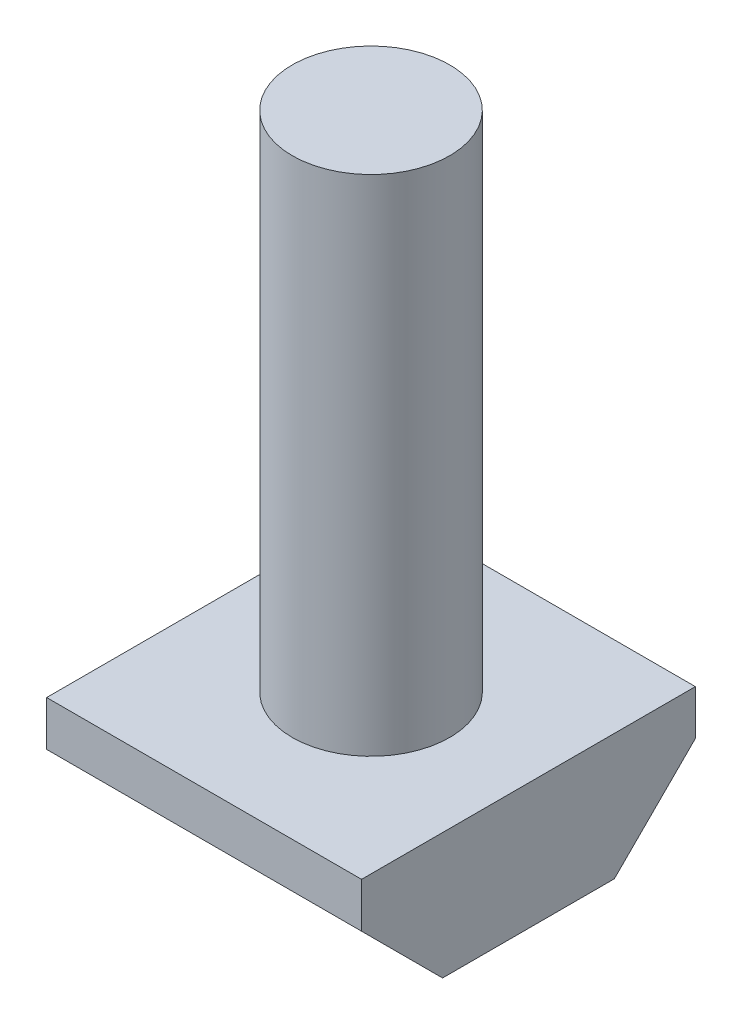
ISO-10303-21;
HEADER;
FILE_DESCRIPTION(('STEP AP214'),'2;1');
FILE_NAME('part.step','',(''),(''),'','','');
FILE_SCHEMA(('AUTOMOTIVE_DESIGN { 1 0 10303 214 1 1 1 1 }'));
ENDSEC;
DATA;
#1=APPLICATION_CONTEXT('core data for automotive mechanical design processes');
#2=APPLICATION_PROTOCOL_DEFINITION('international standard','automotive_design',2000,#1);
#3=PRODUCT_CONTEXT('',#1,'mechanical');
#4=PRODUCT('Part','Part','',(#3));
#5=PRODUCT_RELATED_PRODUCT_CATEGORY('part','',(#4));
#6=PRODUCT_DEFINITION_FORMATION('','',#4);
#7=PRODUCT_DEFINITION_CONTEXT('part definition',#1,'design');
#8=PRODUCT_DEFINITION('design','',#6,#7);
#9=PRODUCT_DEFINITION_SHAPE('','',#8);
#10=(LENGTH_UNIT() NAMED_UNIT(*) SI_UNIT(.MILLI.,.METRE.));
#11=(NAMED_UNIT(*) PLANE_ANGLE_UNIT() SI_UNIT($,.RADIAN.));
#12=(NAMED_UNIT(*) SI_UNIT($,.STERADIAN.) SOLID_ANGLE_UNIT());
#13=UNCERTAINTY_MEASURE_WITH_UNIT(LENGTH_MEASURE(1.E-05),#10,'distance_accuracy_value','');
#14=(GEOMETRIC_REPRESENTATION_CONTEXT(3) GLOBAL_UNCERTAINTY_ASSIGNED_CONTEXT((#13)) GLOBAL_UNIT_ASSIGNED_CONTEXT((#10,
#11,#12)) REPRESENTATION_CONTEXT('',''));
#15=CARTESIAN_POINT('',(0.,0.,0.));
#16=DIRECTION('',(0.,0.,1.));
#17=DIRECTION('',(1.,0.,0.));
#18=AXIS2_PLACEMENT_3D('',#15,#16,#17);
#19=CARTESIAN_POINT('',(10.,12.0661930256703,22.0840138951933));
#20=DIRECTION('',(0.,0.707106781186548,-0.707106781186548));
#21=DIRECTION('',(0.,0.707106781186548,0.707106781186548));
#22=AXIS2_PLACEMENT_3D('',#19,#20,#21);
#23=PLANE('',#22);
#24=DIRECTION('',(0.,-0.707106781186547,-0.707106781186547));
#25=VECTOR('',#24,1.);
#26=CARTESIAN_POINT('',(0.,12.0661930256703,22.0840138951933));
#27=LINE('',#26,#25);
#28=CARTESIAN_POINT('',(0.,12.0661930256703,22.0840138951933));
#29=VERTEX_POINT('',#28);
#30=CARTESIAN_POINT('',(0.,9.49340081953452,19.5112216890575));
#31=VERTEX_POINT('',#30);
#32=EDGE_CURVE('E134',#29,#31,#27,.T.);
#33=ORIENTED_EDGE('',*,*,#32,.T.);
#34=DIRECTION('',(-1.,0.,0.));
#35=VECTOR('',#34,1.);
#36=CARTESIAN_POINT('',(10.,9.49340081953452,19.5112216890575));
#37=LINE('',#36,#35);
#38=CARTESIAN_POINT('',(10.,9.49340081953452,19.5112216890575));
#39=VERTEX_POINT('',#38);
#40=EDGE_CURVE('E46',#39,#31,#37,.T.);
#41=ORIENTED_EDGE('',*,*,#40,.F.);
#42=DIRECTION('',(0.,-0.707106781186547,-0.707106781186547));
#43=VECTOR('',#42,1.);
#44=CARTESIAN_POINT('',(10.,12.0661930256703,22.0840138951933));
#45=LINE('',#44,#43);
#46=CARTESIAN_POINT('',(10.,12.0661930256703,22.0840138951933));
#47=VERTEX_POINT('',#46);
#48=EDGE_CURVE('E151',#47,#39,#45,.T.);
#49=ORIENTED_EDGE('',*,*,#48,.F.);
#50=DIRECTION('',(-1.,0.,0.));
#51=VECTOR('',#50,1.);
#52=CARTESIAN_POINT('',(10.,12.0661930256703,22.0840138951933));
#53=LINE('',#52,#51);
#54=EDGE_CURVE('E130',#47,#29,#53,.T.);
#55=ORIENTED_EDGE('',*,*,#54,.T.);
#56=EDGE_LOOP('',(#33,#41,#49,#55));
#57=FACE_BOUND('',#56,.T.);
#58=ADVANCED_FACE('F43',(#57),#23,.F.);
#59=CARTESIAN_POINT('',(10.,9.49340081953452,19.5112216890575));
#60=DIRECTION('',(0.,1.,0.));
#61=DIRECTION('',(0.,0.,1.));
#62=AXIS2_PLACEMENT_3D('',#59,#60,#61);
#63=PLANE('',#62);
#64=DIRECTION('',(0.,0.,-1.));
#65=VECTOR('',#64,1.);
#66=CARTESIAN_POINT('',(0.,9.49340081953452,19.5112216890575));
#67=LINE('',#66,#65);
#68=CARTESIAN_POINT('',(0.,9.49340081953452,14.0568061013291));
#69=VERTEX_POINT('',#68);
#70=EDGE_CURVE('E138',#31,#69,#67,.T.);
#71=ORIENTED_EDGE('',*,*,#70,.T.);
#72=DIRECTION('',(-1.,0.,0.));
#73=VECTOR('',#72,1.);
#74=CARTESIAN_POINT('',(10.,9.49340081953452,14.0568061013291));
#75=LINE('',#74,#73);
#76=CARTESIAN_POINT('',(10.,9.49340081953452,14.0568061013291));
#77=VERTEX_POINT('',#76);
#78=EDGE_CURVE('E157',#77,#69,#75,.T.);
#79=ORIENTED_EDGE('',*,*,#78,.F.);
#80=DIRECTION('',(0.,0.,-1.));
#81=VECTOR('',#80,1.);
#82=CARTESIAN_POINT('',(10.,9.49340081953452,19.5112216890575));
#83=LINE('',#82,#81);
#84=EDGE_CURVE('E98',#39,#77,#83,.T.);
#85=ORIENTED_EDGE('',*,*,#84,.F.);
#86=ORIENTED_EDGE('',*,*,#40,.T.);
#87=EDGE_LOOP('',(#71,#79,#85,#86));
#88=FACE_BOUND('',#87,.T.);
#89=ADVANCED_FACE('F164',(#88),#63,.F.);
#90=CARTESIAN_POINT('',(10.,9.49340081953452,14.0568061013291));
#91=DIRECTION('',(0.,0.707106781186548,0.707106781186548));
#92=DIRECTION('',(0.,-0.707106781186548,0.707106781186548));
#93=AXIS2_PLACEMENT_3D('',#90,#91,#92);
#94=PLANE('',#93);
#95=DIRECTION('',(0.,0.707106781186547,-0.707106781186547));
#96=VECTOR('',#95,1.);
#97=CARTESIAN_POINT('',(0.,9.49340081953452,14.0568061013291));
#98=LINE('',#97,#96);
#99=CARTESIAN_POINT('',(0.,12.0661930256703,11.4840138951933));
#100=VERTEX_POINT('',#99);
#101=EDGE_CURVE('E142',#69,#100,#98,.T.);
#102=ORIENTED_EDGE('',*,*,#101,.T.);
#103=DIRECTION('',(-1.,0.,0.));
#104=VECTOR('',#103,1.);
#105=CARTESIAN_POINT('',(10.,12.0661930256703,11.4840138951933));
#106=LINE('',#105,#104);
#107=CARTESIAN_POINT('',(10.,12.0661930256703,11.4840138951933));
#108=VERTEX_POINT('',#107);
#109=EDGE_CURVE('E123',#108,#100,#106,.T.);
#110=ORIENTED_EDGE('',*,*,#109,.F.);
#111=DIRECTION('',(0.,0.707106781186547,-0.707106781186547));
#112=VECTOR('',#111,1.);
#113=CARTESIAN_POINT('',(10.,9.49340081953452,14.0568061013291));
#114=LINE('',#113,#112);
#115=EDGE_CURVE('E111',#77,#108,#114,.T.);
#116=ORIENTED_EDGE('',*,*,#115,.F.);
#117=ORIENTED_EDGE('',*,*,#78,.T.);
#118=EDGE_LOOP('',(#102,#110,#116,#117));
#119=FACE_BOUND('',#118,.T.);
#120=ADVANCED_FACE('F170',(#119),#94,.F.);
#121=CARTESIAN_POINT('',(10.,12.0661930256703,11.4840138951933));
#122=DIRECTION('',(0.,0.,1.));
#123=DIRECTION('',(1.,0.,0.));
#124=AXIS2_PLACEMENT_3D('',#121,#122,#123);
#125=PLANE('',#124);
#126=DIRECTION('',(0.,1.,0.));
#127=VECTOR('',#126,1.);
#128=CARTESIAN_POINT('',(0.,12.0661930256703,11.4840138951933));
#129=LINE('',#128,#127);
#130=CARTESIAN_POINT('',(0.,13.4934008195345,11.4840138951933));
#131=VERTEX_POINT('',#130);
#132=EDGE_CURVE('E121',#100,#131,#129,.T.);
#133=ORIENTED_EDGE('',*,*,#132,.T.);
#134=DIRECTION('',(-1.,0.,0.));
#135=VECTOR('',#134,1.);
#136=CARTESIAN_POINT('',(10.,13.4934008195345,11.4840138951933));
#137=LINE('',#136,#135);
#138=CARTESIAN_POINT('',(10.,13.4934008195345,11.4840138951933));
#139=VERTEX_POINT('',#138);
#140=EDGE_CURVE('E118',#139,#131,#137,.T.);
#141=ORIENTED_EDGE('',*,*,#140,.F.);
#142=DIRECTION('',(0.,1.,0.));
#143=VECTOR('',#142,1.);
#144=CARTESIAN_POINT('',(10.,12.0661930256703,11.4840138951933));
#145=LINE('',#144,#143);
#146=EDGE_CURVE('E105',#108,#139,#145,.T.);
#147=ORIENTED_EDGE('',*,*,#146,.F.);
#148=ORIENTED_EDGE('',*,*,#109,.T.);
#149=EDGE_LOOP('',(#133,#141,#147,#148));
#150=FACE_BOUND('',#149,.T.);
#151=ADVANCED_FACE('F119',(#150),#125,.F.);
#152=CARTESIAN_POINT('',(10.,13.4934008195345,19.8840138951933));
#153=DIRECTION('',(0.,-1.,0.));
#154=DIRECTION('',(0.,0.,-1.));
#155=AXIS2_PLACEMENT_3D('',#152,#153,#154);
#156=PLANE('',#155);
#157=CARTESIAN_POINT('',(5.,13.4934008195345,16.7840138951933));
#158=DIRECTION('',(0.,1.,0.));
#159=DIRECTION('',(0.,0.,1.));
#160=AXIS2_PLACEMENT_3D('',#157,#158,#159);
#161=CIRCLE('',#160,2.5);
#162=CARTESIAN_POINT('',(5.,13.4934008195345,19.2840138951933));
#163=VERTEX_POINT('',#162);
#164=EDGE_CURVE('E11',#163,#163,#161,.T.);
#165=ORIENTED_EDGE('',*,*,#164,.F.);
#166=EDGE_LOOP('',(#165));
#167=FACE_BOUND('',#166,.T.);
#168=DIRECTION('',(0.,0.,1.));
#169=VECTOR('',#168,1.);
#170=CARTESIAN_POINT('',(0.,13.4934008195345,19.8840138951933));
#171=LINE('',#170,#169);
#172=CARTESIAN_POINT('',(0.,13.4934008195345,22.0840138951933));
#173=VERTEX_POINT('',#172);
#174=EDGE_CURVE('E83',#131,#173,#171,.T.);
#175=ORIENTED_EDGE('',*,*,#174,.T.);
#176=DIRECTION('',(-1.,0.,0.));
#177=VECTOR('',#176,1.);
#178=CARTESIAN_POINT('',(10.,13.4934008195345,22.0840138951933));
#179=LINE('',#178,#177);
#180=CARTESIAN_POINT('',(10.,13.4934008195345,22.0840138951933));
#181=VERTEX_POINT('',#180);
#182=EDGE_CURVE('E124',#181,#173,#179,.T.);
#183=ORIENTED_EDGE('',*,*,#182,.F.);
#184=DIRECTION('',(0.,0.,1.));
#185=VECTOR('',#184,1.);
#186=CARTESIAN_POINT('',(10.,13.4934008195345,11.4840138951933));
#187=LINE('',#186,#185);
#188=EDGE_CURVE('E109',#139,#181,#187,.T.);
#189=ORIENTED_EDGE('',*,*,#188,.F.);
#190=ORIENTED_EDGE('',*,*,#140,.T.);
#191=EDGE_LOOP('',(#175,#183,#189,#190));
#192=FACE_BOUND('',#191,.T.);
#193=ADVANCED_FACE('F126',(#167,#192),#156,.F.);
#194=CARTESIAN_POINT('',(10.,13.4934008195345,22.0840138951933));
#195=DIRECTION('',(0.,0.,-1.));
#196=DIRECTION('',(-1.,0.,0.));
#197=AXIS2_PLACEMENT_3D('',#194,#195,#196);
#198=PLANE('',#197);
#199=DIRECTION('',(0.,-1.,0.));
#200=VECTOR('',#199,1.);
#201=CARTESIAN_POINT('',(0.,13.4934008195345,22.0840138951933));
#202=LINE('',#201,#200);
#203=EDGE_CURVE('E89',#173,#29,#202,.T.);
#204=ORIENTED_EDGE('',*,*,#203,.T.);
#205=ORIENTED_EDGE('',*,*,#54,.F.);
#206=DIRECTION('',(0.,-1.,0.));
#207=VECTOR('',#206,1.);
#208=CARTESIAN_POINT('',(10.,13.4934008195345,22.0840138951933));
#209=LINE('',#208,#207);
#210=EDGE_CURVE('E61',#181,#47,#209,.T.);
#211=ORIENTED_EDGE('',*,*,#210,.F.);
#212=ORIENTED_EDGE('',*,*,#182,.T.);
#213=EDGE_LOOP('',(#204,#205,#211,#212));
#214=FACE_BOUND('',#213,.T.);
#215=ADVANCED_FACE('F190',(#214),#198,.F.);
#216=CARTESIAN_POINT('',(10.,0.,0.));
#217=DIRECTION('',(1.,0.,0.));
#218=DIRECTION('',(0.,0.,-1.));
#219=AXIS2_PLACEMENT_3D('',#216,#217,#218);
#220=PLANE('',#219);
#221=ORIENTED_EDGE('',*,*,#48,.T.);
#222=ORIENTED_EDGE('',*,*,#84,.T.);
#223=ORIENTED_EDGE('',*,*,#115,.T.);
#224=ORIENTED_EDGE('',*,*,#146,.T.);
#225=ORIENTED_EDGE('',*,*,#188,.T.);
#226=ORIENTED_EDGE('',*,*,#210,.T.);
#227=EDGE_LOOP('',(#221,#222,#223,#224,#225,#226));
#228=FACE_BOUND('',#227,.T.);
#229=ADVANCED_FACE('F107',(#228),#220,.T.);
#230=CARTESIAN_POINT('',(0.,0.,0.));
#231=DIRECTION('',(1.,0.,0.));
#232=DIRECTION('',(0.,0.,-1.));
#233=AXIS2_PLACEMENT_3D('',#230,#231,#232);
#234=PLANE('',#233);
#235=ORIENTED_EDGE('',*,*,#32,.F.);
#236=ORIENTED_EDGE('',*,*,#203,.F.);
#237=ORIENTED_EDGE('',*,*,#174,.F.);
#238=ORIENTED_EDGE('',*,*,#132,.F.);
#239=ORIENTED_EDGE('',*,*,#101,.F.);
#240=ORIENTED_EDGE('',*,*,#70,.F.);
#241=EDGE_LOOP('',(#235,#236,#237,#238,#239,#240));
#242=FACE_BOUND('',#241,.T.);
#243=ADVANCED_FACE('F169',(#242),#234,.F.);
#244=CARTESIAN_POINT('',(5.,29.4934008195345,16.7840138951932));
#245=DIRECTION('',(0.,-1.,0.));
#246=DIRECTION('',(0.,0.,-1.));
#247=AXIS2_PLACEMENT_3D('',#244,#245,#246);
#248=CYLINDRICAL_SURFACE('',#247,2.5);
#249=CARTESIAN_POINT('',(5.,29.4934008195345,16.7840138951932));
#250=DIRECTION('',(0.,1.,0.));
#251=DIRECTION('',(0.,0.,1.));
#252=AXIS2_PLACEMENT_3D('',#249,#250,#251);
#253=CIRCLE('',#252,2.5);
#254=CARTESIAN_POINT('',(5.,29.4934008195345,19.2840138951932));
#255=VERTEX_POINT('',#254);
#256=EDGE_CURVE('E139',#255,#255,#253,.T.);
#257=ORIENTED_EDGE('',*,*,#256,.F.);
#258=EDGE_LOOP('',(#257));
#259=FACE_BOUND('',#258,.T.);
#260=ORIENTED_EDGE('',*,*,#164,.T.);
#261=EDGE_LOOP('',(#260));
#262=FACE_BOUND('',#261,.T.);
#263=ADVANCED_FACE('F183',(#259,#262),#248,.T.);
#264=CARTESIAN_POINT('',(0.,29.4934008195345,0.));
#265=DIRECTION('',(0.,1.,0.));
#266=DIRECTION('',(0.,0.,1.));
#267=AXIS2_PLACEMENT_3D('',#264,#265,#266);
#268=PLANE('',#267);
#269=ORIENTED_EDGE('',*,*,#256,.T.);
#270=EDGE_LOOP('',(#269));
#271=FACE_BOUND('',#270,.T.);
#272=ADVANCED_FACE('F181',(#271),#268,.T.);
#273=CLOSED_SHELL('',(#58,#89,#120,#151,#193,#215,#229,#243,#263,#272));
#274=MANIFOLD_SOLID_BREP('B2',#273);
#275=ADVANCED_BREP_SHAPE_REPRESENTATION('',(#18,#274),#14);
#276=SHAPE_DEFINITION_REPRESENTATION(#9,#275);
ENDSEC;
END-ISO-10303-21;
